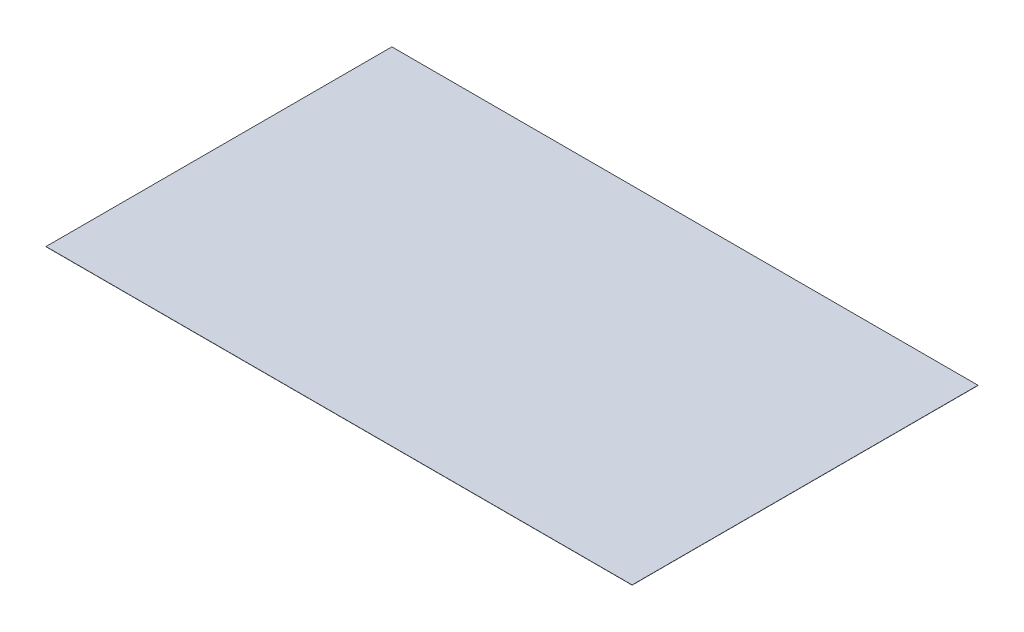
ISO-10303-21;
HEADER;
FILE_DESCRIPTION(('STEP AP214'),'2;1');
FILE_NAME('part.step','',(''),(''),'','','');
FILE_SCHEMA(('AUTOMOTIVE_DESIGN { 1 0 10303 214 1 1 1 1 }'));
ENDSEC;
DATA;
#1=APPLICATION_CONTEXT('core data for automotive mechanical design processes');
#2=APPLICATION_PROTOCOL_DEFINITION('international standard','automotive_design',2000,#1);
#3=PRODUCT_CONTEXT('',#1,'mechanical');
#4=PRODUCT('Part','Part','',(#3));
#5=PRODUCT_RELATED_PRODUCT_CATEGORY('part','',(#4));
#6=PRODUCT_DEFINITION_FORMATION('','',#4);
#7=PRODUCT_DEFINITION_CONTEXT('part definition',#1,'design');
#8=PRODUCT_DEFINITION('design','',#6,#7);
#9=PRODUCT_DEFINITION_SHAPE('','',#8);
#10=(LENGTH_UNIT() NAMED_UNIT(*) SI_UNIT(.MILLI.,.METRE.));
#11=(NAMED_UNIT(*) PLANE_ANGLE_UNIT() SI_UNIT($,.RADIAN.));
#12=(NAMED_UNIT(*) SI_UNIT($,.STERADIAN.) SOLID_ANGLE_UNIT());
#13=UNCERTAINTY_MEASURE_WITH_UNIT(LENGTH_MEASURE(1.E-05),#10,'distance_accuracy_value','');
#14=(GEOMETRIC_REPRESENTATION_CONTEXT(3) GLOBAL_UNCERTAINTY_ASSIGNED_CONTEXT((#13)) GLOBAL_UNIT_ASSIGNED_CONTEXT((#10,
#11,#12)) REPRESENTATION_CONTEXT('',''));
#15=CARTESIAN_POINT('',(0.,0.,0.));
#16=DIRECTION('',(0.,0.,1.));
#17=DIRECTION('',(1.,0.,0.));
#18=AXIS2_PLACEMENT_3D('',#15,#16,#17);
#19=CARTESIAN_POINT('',(-170.591628478085,0.1,-95.918736158923));
#20=DIRECTION('',(1.,0.,0.));
#21=DIRECTION('',(0.,0.,-1.));
#22=AXIS2_PLACEMENT_3D('',#19,#20,#21);
#23=PLANE('',#22);
#24=DIRECTION('',(0.,0.,1.));
#25=VECTOR('',#24,1.);
#26=CARTESIAN_POINT('',(-170.591628478085,0.,-95.918736158923));
#27=LINE('',#26,#25);
#28=CARTESIAN_POINT('',(-170.591628478085,0.,-95.918736158923));
#29=VERTEX_POINT('',#28);
#30=CARTESIAN_POINT('',(-170.591628478085,0.,99.2514175455522));
#31=VERTEX_POINT('',#30);
#32=EDGE_CURVE('E98',#29,#31,#27,.T.);
#33=ORIENTED_EDGE('',*,*,#32,.T.);
#34=DIRECTION('',(0.,-1.,0.));
#35=VECTOR('',#34,1.);
#36=CARTESIAN_POINT('',(-170.591628478085,0.1,99.2514175455522));
#37=LINE('',#36,#35);
#38=CARTESIAN_POINT('',(-170.591628478085,0.1,99.2514175455522));
#39=VERTEX_POINT('',#38);
#40=EDGE_CURVE('E11',#39,#31,#37,.T.);
#41=ORIENTED_EDGE('',*,*,#40,.F.);
#42=DIRECTION('',(0.,0.,1.));
#43=VECTOR('',#42,1.);
#44=CARTESIAN_POINT('',(-170.591628478085,0.1,-95.918736158923));
#45=LINE('',#44,#43);
#46=CARTESIAN_POINT('',(-170.591628478085,0.1,-95.918736158923));
#47=VERTEX_POINT('',#46);
#48=EDGE_CURVE('E86',#47,#39,#45,.T.);
#49=ORIENTED_EDGE('',*,*,#48,.F.);
#50=DIRECTION('',(0.,-1.,0.));
#51=VECTOR('',#50,1.);
#52=CARTESIAN_POINT('',(-170.591628478085,0.1,-95.918736158923));
#53=LINE('',#52,#51);
#54=EDGE_CURVE('E94',#47,#29,#53,.T.);
#55=ORIENTED_EDGE('',*,*,#54,.T.);
#56=EDGE_LOOP('',(#33,#41,#49,#55));
#57=FACE_BOUND('',#56,.T.);
#58=ADVANCED_FACE('F35',(#57),#23,.F.);
#59=CARTESIAN_POINT('',(-170.591628478085,0.1,99.2514175455522));
#60=DIRECTION('',(0.,0.,-1.));
#61=DIRECTION('',(-1.,0.,0.));
#62=AXIS2_PLACEMENT_3D('',#59,#60,#61);
#63=PLANE('',#62);
#64=DIRECTION('',(1.,0.,0.));
#65=VECTOR('',#64,1.);
#66=CARTESIAN_POINT('',(-170.591628478085,0.,99.2514175455522));
#67=LINE('',#66,#65);
#68=CARTESIAN_POINT('',(160.176999144868,0.,99.2514175455522));
#69=VERTEX_POINT('',#68);
#70=EDGE_CURVE('E90',#31,#69,#67,.T.);
#71=ORIENTED_EDGE('',*,*,#70,.T.);
#72=DIRECTION('',(0.,-1.,0.));
#73=VECTOR('',#72,1.);
#74=CARTESIAN_POINT('',(160.176999144868,0.1,99.2514175455522));
#75=LINE('',#74,#73);
#76=CARTESIAN_POINT('',(160.176999144868,0.1,99.2514175455522));
#77=VERTEX_POINT('',#76);
#78=EDGE_CURVE('E43',#77,#69,#75,.T.);
#79=ORIENTED_EDGE('',*,*,#78,.F.);
#80=DIRECTION('',(1.,0.,0.));
#81=VECTOR('',#80,1.);
#82=CARTESIAN_POINT('',(-170.591628478085,0.1,99.2514175455522));
#83=LINE('',#82,#81);
#84=EDGE_CURVE('E81',#39,#77,#83,.T.);
#85=ORIENTED_EDGE('',*,*,#84,.F.);
#86=ORIENTED_EDGE('',*,*,#40,.T.);
#87=EDGE_LOOP('',(#71,#79,#85,#86));
#88=FACE_BOUND('',#87,.T.);
#89=ADVANCED_FACE('F89',(#88),#63,.F.);
#90=CARTESIAN_POINT('',(160.176999144868,0.1,-95.918736158923));
#91=DIRECTION('',(-1.,0.,0.));
#92=DIRECTION('',(0.,0.,1.));
#93=AXIS2_PLACEMENT_3D('',#90,#91,#92);
#94=PLANE('',#93);
#95=DIRECTION('',(0.,0.,-1.));
#96=VECTOR('',#95,1.);
#97=CARTESIAN_POINT('',(160.176999144868,0.,-95.918736158923));
#98=LINE('',#97,#96);
#99=CARTESIAN_POINT('',(160.176999144868,0.,-95.918736158923));
#100=VERTEX_POINT('',#99);
#101=EDGE_CURVE('E68',#69,#100,#98,.T.);
#102=ORIENTED_EDGE('',*,*,#101,.T.);
#103=DIRECTION('',(0.,-1.,0.));
#104=VECTOR('',#103,1.);
#105=CARTESIAN_POINT('',(160.176999144868,0.1,-95.918736158923));
#106=LINE('',#105,#104);
#107=CARTESIAN_POINT('',(160.176999144868,0.1,-95.918736158923));
#108=VERTEX_POINT('',#107);
#109=EDGE_CURVE('E91',#108,#100,#106,.T.);
#110=ORIENTED_EDGE('',*,*,#109,.F.);
#111=DIRECTION('',(0.,0.,-1.));
#112=VECTOR('',#111,1.);
#113=CARTESIAN_POINT('',(160.176999144868,0.1,-95.918736158923));
#114=LINE('',#113,#112);
#115=EDGE_CURVE('E84',#77,#108,#114,.T.);
#116=ORIENTED_EDGE('',*,*,#115,.F.);
#117=ORIENTED_EDGE('',*,*,#78,.T.);
#118=EDGE_LOOP('',(#102,#110,#116,#117));
#119=FACE_BOUND('',#118,.T.);
#120=ADVANCED_FACE('F92',(#119),#94,.F.);
#121=CARTESIAN_POINT('',(-170.591628478085,0.1,-95.918736158923));
#122=DIRECTION('',(0.,0.,1.));
#123=DIRECTION('',(1.,0.,0.));
#124=AXIS2_PLACEMENT_3D('',#121,#122,#123);
#125=PLANE('',#124);
#126=DIRECTION('',(-1.,0.,0.));
#127=VECTOR('',#126,1.);
#128=CARTESIAN_POINT('',(-170.591628478085,0.,-95.918736158923));
#129=LINE('',#128,#127);
#130=EDGE_CURVE('E74',#100,#29,#129,.T.);
#131=ORIENTED_EDGE('',*,*,#130,.T.);
#132=ORIENTED_EDGE('',*,*,#54,.F.);
#133=DIRECTION('',(-1.,0.,0.));
#134=VECTOR('',#133,1.);
#135=CARTESIAN_POINT('',(-170.591628478085,0.1,-95.918736158923));
#136=LINE('',#135,#134);
#137=EDGE_CURVE('E51',#108,#47,#136,.T.);
#138=ORIENTED_EDGE('',*,*,#137,.F.);
#139=ORIENTED_EDGE('',*,*,#109,.T.);
#140=EDGE_LOOP('',(#131,#132,#138,#139));
#141=FACE_BOUND('',#140,.T.);
#142=ADVANCED_FACE('F105',(#141),#125,.F.);
#143=CARTESIAN_POINT('',(0.,0.1,0.));
#144=DIRECTION('',(0.,1.,0.));
#145=DIRECTION('',(0.,0.,1.));
#146=AXIS2_PLACEMENT_3D('',#143,#144,#145);
#147=PLANE('',#146);
#148=ORIENTED_EDGE('',*,*,#48,.T.);
#149=ORIENTED_EDGE('',*,*,#84,.T.);
#150=ORIENTED_EDGE('',*,*,#115,.T.);
#151=ORIENTED_EDGE('',*,*,#137,.T.);
#152=EDGE_LOOP('',(#148,#149,#150,#151));
#153=FACE_BOUND('',#152,.T.);
#154=ADVANCED_FACE('F82',(#153),#147,.T.);
#155=CARTESIAN_POINT('',(0.,0.,0.));
#156=DIRECTION('',(0.,1.,0.));
#157=DIRECTION('',(0.,0.,1.));
#158=AXIS2_PLACEMENT_3D('',#155,#156,#157);
#159=PLANE('',#158);
#160=ORIENTED_EDGE('',*,*,#32,.F.);
#161=ORIENTED_EDGE('',*,*,#130,.F.);
#162=ORIENTED_EDGE('',*,*,#101,.F.);
#163=ORIENTED_EDGE('',*,*,#70,.F.);
#164=EDGE_LOOP('',(#160,#161,#162,#163));
#165=FACE_BOUND('',#164,.T.);
#166=ADVANCED_FACE('F108',(#165),#159,.F.);
#167=CLOSED_SHELL('',(#58,#89,#120,#142,#154,#166));
#168=MANIFOLD_SOLID_BREP('B2',#167);
#169=ADVANCED_BREP_SHAPE_REPRESENTATION('',(#18,#168),#14);
#170=SHAPE_DEFINITION_REPRESENTATION(#9,#169);
ENDSEC;
END-ISO-10303-21;
